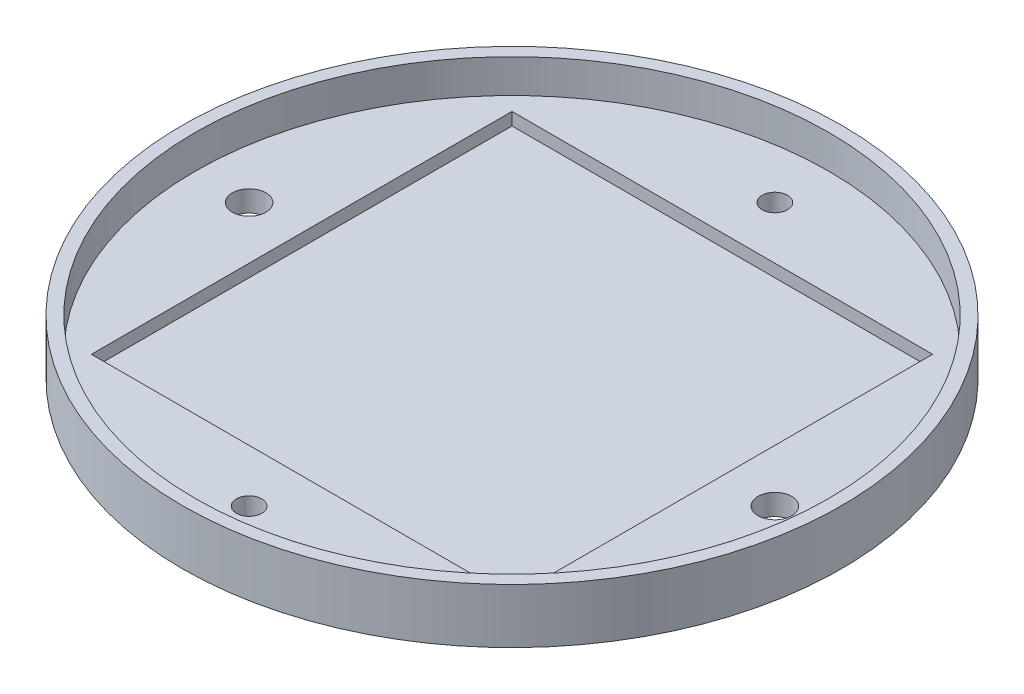
ISO-10303-21;
HEADER;
FILE_DESCRIPTION(('STEP AP214'),'2;1');
FILE_NAME('part.step','',(''),(''),'','','');
FILE_SCHEMA(('AUTOMOTIVE_DESIGN { 1 0 10303 214 1 1 1 1 }'));
ENDSEC;
DATA;
#1=APPLICATION_CONTEXT('core data for automotive mechanical design processes');
#2=APPLICATION_PROTOCOL_DEFINITION('international standard','automotive_design',2000,#1);
#3=PRODUCT_CONTEXT('',#1,'mechanical');
#4=PRODUCT('Part','Part','',(#3));
#5=PRODUCT_RELATED_PRODUCT_CATEGORY('part','',(#4));
#6=PRODUCT_DEFINITION_FORMATION('','',#4);
#7=PRODUCT_DEFINITION_CONTEXT('part definition',#1,'design');
#8=PRODUCT_DEFINITION('design','',#6,#7);
#9=PRODUCT_DEFINITION_SHAPE('','',#8);
#10=(LENGTH_UNIT() NAMED_UNIT(*) SI_UNIT(.MILLI.,.METRE.));
#11=(NAMED_UNIT(*) PLANE_ANGLE_UNIT() SI_UNIT($,.RADIAN.));
#12=(NAMED_UNIT(*) SI_UNIT($,.STERADIAN.) SOLID_ANGLE_UNIT());
#13=UNCERTAINTY_MEASURE_WITH_UNIT(LENGTH_MEASURE(1.E-05),#10,'distance_accuracy_value','');
#14=(GEOMETRIC_REPRESENTATION_CONTEXT(3) GLOBAL_UNCERTAINTY_ASSIGNED_CONTEXT((#13)) GLOBAL_UNIT_ASSIGNED_CONTEXT((#10,
#11,#12)) REPRESENTATION_CONTEXT('',''));
#15=CARTESIAN_POINT('',(0.,0.,0.));
#16=DIRECTION('',(0.,0.,1.));
#17=DIRECTION('',(1.,0.,0.));
#18=AXIS2_PLACEMENT_3D('',#15,#16,#17);
#19=CARTESIAN_POINT('',(0.,5.,0.));
#20=DIRECTION('',(0.,1.,0.));
#21=DIRECTION('',(0.,0.,1.));
#22=AXIS2_PLACEMENT_3D('',#19,#20,#21);
#23=PLANE('',#22);
#24=DIRECTION('',(0.,0.,-1.));
#25=VECTOR('',#24,1.);
#26=CARTESIAN_POINT('',(50.,5.,50.));
#27=LINE('',#26,#25);
#28=CARTESIAN_POINT('',(50.,5.,50.));
#29=VERTEX_POINT('',#28);
#30=CARTESIAN_POINT('',(50.,5.,-50.));
#31=VERTEX_POINT('',#30);
#32=EDGE_CURVE('E55',#29,#31,#27,.T.);
#33=ORIENTED_EDGE('',*,*,#32,.F.);
#34=DIRECTION('',(1.,0.,0.));
#35=VECTOR('',#34,1.);
#36=CARTESIAN_POINT('',(-50.,5.,50.));
#37=LINE('',#36,#35);
#38=CARTESIAN_POINT('',(-50.,5.,50.));
#39=VERTEX_POINT('',#38);
#40=EDGE_CURVE('E110',#39,#29,#37,.T.);
#41=ORIENTED_EDGE('',*,*,#40,.F.);
#42=DIRECTION('',(0.,0.,1.));
#43=VECTOR('',#42,1.);
#44=CARTESIAN_POINT('',(-50.,5.,50.));
#45=LINE('',#44,#43);
#46=CARTESIAN_POINT('',(-50.,5.,-50.));
#47=VERTEX_POINT('',#46);
#48=EDGE_CURVE('E119',#47,#39,#45,.T.);
#49=ORIENTED_EDGE('',*,*,#48,.F.);
#50=DIRECTION('',(-1.,0.,0.));
#51=VECTOR('',#50,1.);
#52=CARTESIAN_POINT('',(-50.,5.,-50.));
#53=LINE('',#52,#51);
#54=EDGE_CURVE('E90',#31,#47,#53,.T.);
#55=ORIENTED_EDGE('',*,*,#54,.F.);
#56=EDGE_LOOP('',(#33,#41,#49,#55));
#57=FACE_BOUND('',#56,.T.);
#58=CARTESIAN_POINT('',(0.,5.,62.5));
#59=DIRECTION('',(0.,1.,0.));
#60=DIRECTION('',(0.,0.,1.));
#61=AXIS2_PLACEMENT_3D('',#58,#59,#60);
#62=CIRCLE('',#61,3.);
#63=CARTESIAN_POINT('',(0.,5.,65.5));
#64=VERTEX_POINT('',#63);
#65=EDGE_CURVE('E139',#64,#64,#62,.T.);
#66=ORIENTED_EDGE('',*,*,#65,.F.);
#67=EDGE_LOOP('',(#66));
#68=FACE_BOUND('',#67,.T.);
#69=CARTESIAN_POINT('',(62.5,5.,0.));
#70=DIRECTION('',(0.,1.,0.));
#71=DIRECTION('',(0.,0.,1.));
#72=AXIS2_PLACEMENT_3D('',#69,#70,#71);
#73=CIRCLE('',#72,4.00000000000001);
#74=CARTESIAN_POINT('',(62.5,5.,4.00000000000001));
#75=VERTEX_POINT('',#74);
#76=EDGE_CURVE('E155',#75,#75,#73,.T.);
#77=ORIENTED_EDGE('',*,*,#76,.F.);
#78=EDGE_LOOP('',(#77));
#79=FACE_BOUND('',#78,.T.);
#80=CARTESIAN_POINT('',(-62.5,5.,0.));
#81=DIRECTION('',(0.,1.,0.));
#82=DIRECTION('',(0.,0.,1.));
#83=AXIS2_PLACEMENT_3D('',#80,#81,#82);
#84=CIRCLE('',#83,4.00000000000001);
#85=CARTESIAN_POINT('',(-62.5,5.,4.00000000000001));
#86=VERTEX_POINT('',#85);
#87=EDGE_CURVE('E163',#86,#86,#84,.T.);
#88=ORIENTED_EDGE('',*,*,#87,.F.);
#89=EDGE_LOOP('',(#88));
#90=FACE_BOUND('',#89,.T.);
#91=CARTESIAN_POINT('',(0.,5.,-62.5));
#92=DIRECTION('',(0.,1.,0.));
#93=DIRECTION('',(0.,0.,1.));
#94=AXIS2_PLACEMENT_3D('',#91,#92,#93);
#95=CIRCLE('',#94,3.);
#96=CARTESIAN_POINT('',(0.,5.,-59.5));
#97=VERTEX_POINT('',#96);
#98=EDGE_CURVE('E147',#97,#97,#95,.T.);
#99=ORIENTED_EDGE('',*,*,#98,.F.);
#100=EDGE_LOOP('',(#99));
#101=FACE_BOUND('',#100,.T.);
#102=CARTESIAN_POINT('',(0.,5.,0.));
#103=DIRECTION('',(0.,1.,0.));
#104=DIRECTION('',(0.,0.,1.));
#105=AXIS2_PLACEMENT_3D('',#102,#103,#104);
#106=CIRCLE('',#105,75.35);
#107=CARTESIAN_POINT('',(0.,5.,75.35));
#108=VERTEX_POINT('',#107);
#109=EDGE_CURVE('E11',#108,#108,#106,.F.);
#110=ORIENTED_EDGE('',*,*,#109,.F.);
#111=EDGE_LOOP('',(#110));
#112=FACE_BOUND('',#111,.T.);
#113=ADVANCED_FACE('F39',(#57,#68,#79,#90,#101,#112),#23,.T.);
#114=CARTESIAN_POINT('',(0.,0.,0.));
#115=DIRECTION('',(0.,1.,0.));
#116=DIRECTION('',(0.,0.,1.));
#117=AXIS2_PLACEMENT_3D('',#114,#115,#116);
#118=PLANE('',#117);
#119=CARTESIAN_POINT('',(0.,0.,0.));
#120=DIRECTION('',(0.,1.,0.));
#121=DIRECTION('',(0.,0.,1.));
#122=AXIS2_PLACEMENT_3D('',#119,#120,#121);
#123=CIRCLE('',#122,78.35);
#124=CARTESIAN_POINT('',(0.,0.,78.35));
#125=VERTEX_POINT('',#124);
#126=EDGE_CURVE('E48',#125,#125,#123,.T.);
#127=ORIENTED_EDGE('',*,*,#126,.F.);
#128=EDGE_LOOP('',(#127));
#129=FACE_BOUND('',#128,.T.);
#130=CARTESIAN_POINT('',(-62.5,0.,0.));
#131=DIRECTION('',(0.,1.,0.));
#132=DIRECTION('',(0.,0.,1.));
#133=AXIS2_PLACEMENT_3D('',#130,#131,#132);
#134=CIRCLE('',#133,4.00000000000001);
#135=CARTESIAN_POINT('',(-62.5,0.,4.00000000000001));
#136=VERTEX_POINT('',#135);
#137=EDGE_CURVE('E159',#136,#136,#134,.T.);
#138=ORIENTED_EDGE('',*,*,#137,.T.);
#139=EDGE_LOOP('',(#138));
#140=FACE_BOUND('',#139,.T.);
#141=CARTESIAN_POINT('',(62.5,0.,0.));
#142=DIRECTION('',(0.,1.,0.));
#143=DIRECTION('',(0.,0.,1.));
#144=AXIS2_PLACEMENT_3D('',#141,#142,#143);
#145=CIRCLE('',#144,4.00000000000001);
#146=CARTESIAN_POINT('',(62.5,0.,4.00000000000001));
#147=VERTEX_POINT('',#146);
#148=EDGE_CURVE('E151',#147,#147,#145,.T.);
#149=ORIENTED_EDGE('',*,*,#148,.T.);
#150=EDGE_LOOP('',(#149));
#151=FACE_BOUND('',#150,.T.);
#152=CARTESIAN_POINT('',(0.,0.,-62.5));
#153=DIRECTION('',(0.,1.,0.));
#154=DIRECTION('',(0.,0.,1.));
#155=AXIS2_PLACEMENT_3D('',#152,#153,#154);
#156=CIRCLE('',#155,3.);
#157=CARTESIAN_POINT('',(0.,0.,-59.5));
#158=VERTEX_POINT('',#157);
#159=EDGE_CURVE('E143',#158,#158,#156,.T.);
#160=ORIENTED_EDGE('',*,*,#159,.T.);
#161=EDGE_LOOP('',(#160));
#162=FACE_BOUND('',#161,.T.);
#163=CARTESIAN_POINT('',(0.,0.,62.5));
#164=DIRECTION('',(0.,1.,0.));
#165=DIRECTION('',(0.,0.,1.));
#166=AXIS2_PLACEMENT_3D('',#163,#164,#165);
#167=CIRCLE('',#166,3.);
#168=CARTESIAN_POINT('',(0.,0.,65.5));
#169=VERTEX_POINT('',#168);
#170=EDGE_CURVE('E138',#169,#169,#167,.T.);
#171=ORIENTED_EDGE('',*,*,#170,.T.);
#172=EDGE_LOOP('',(#171));
#173=FACE_BOUND('',#172,.T.);
#174=ADVANCED_FACE('F175',(#129,#140,#151,#162,#173),#118,.F.);
#175=CARTESIAN_POINT('',(0.,5.,0.));
#176=DIRECTION('',(0.,-1.,0.));
#177=DIRECTION('',(0.,0.,-1.));
#178=AXIS2_PLACEMENT_3D('',#175,#176,#177);
#179=CYLINDRICAL_SURFACE('',#178,78.35);
#180=ORIENTED_EDGE('',*,*,#126,.T.);
#181=EDGE_LOOP('',(#180));
#182=FACE_BOUND('',#181,.T.);
#183=CARTESIAN_POINT('',(0.,13.,0.));
#184=DIRECTION('',(0.,1.,0.));
#185=DIRECTION('',(0.,0.,1.));
#186=AXIS2_PLACEMENT_3D('',#183,#184,#185);
#187=CIRCLE('',#186,78.35);
#188=CARTESIAN_POINT('',(0.,13.,78.35));
#189=VERTEX_POINT('',#188);
#190=EDGE_CURVE('E134',#189,#189,#187,.T.);
#191=ORIENTED_EDGE('',*,*,#190,.F.);
#192=EDGE_LOOP('',(#191));
#193=FACE_BOUND('',#192,.T.);
#194=ADVANCED_FACE('F41',(#182,#193),#179,.T.);
#195=CARTESIAN_POINT('',(-62.5,5.,0.));
#196=DIRECTION('',(0.,-1.,0.));
#197=DIRECTION('',(0.,0.,-1.));
#198=AXIS2_PLACEMENT_3D('',#195,#196,#197);
#199=CYLINDRICAL_SURFACE('',#198,4.00000000000001);
#200=ORIENTED_EDGE('',*,*,#87,.T.);
#201=EDGE_LOOP('',(#200));
#202=FACE_BOUND('',#201,.T.);
#203=ORIENTED_EDGE('',*,*,#137,.F.);
#204=EDGE_LOOP('',(#203));
#205=FACE_BOUND('',#204,.T.);
#206=ADVANCED_FACE('F209',(#202,#205),#199,.F.);
#207=CARTESIAN_POINT('',(62.5,5.,0.));
#208=DIRECTION('',(0.,-1.,0.));
#209=DIRECTION('',(0.,0.,-1.));
#210=AXIS2_PLACEMENT_3D('',#207,#208,#209);
#211=CYLINDRICAL_SURFACE('',#210,4.00000000000001);
#212=ORIENTED_EDGE('',*,*,#76,.T.);
#213=EDGE_LOOP('',(#212));
#214=FACE_BOUND('',#213,.T.);
#215=ORIENTED_EDGE('',*,*,#148,.F.);
#216=EDGE_LOOP('',(#215));
#217=FACE_BOUND('',#216,.T.);
#218=ADVANCED_FACE('F199',(#214,#217),#211,.F.);
#219=CARTESIAN_POINT('',(0.,5.,-62.5));
#220=DIRECTION('',(0.,-1.,0.));
#221=DIRECTION('',(0.,0.,-1.));
#222=AXIS2_PLACEMENT_3D('',#219,#220,#221);
#223=CYLINDRICAL_SURFACE('',#222,3.);
#224=ORIENTED_EDGE('',*,*,#98,.T.);
#225=EDGE_LOOP('',(#224));
#226=FACE_BOUND('',#225,.T.);
#227=ORIENTED_EDGE('',*,*,#159,.F.);
#228=EDGE_LOOP('',(#227));
#229=FACE_BOUND('',#228,.T.);
#230=ADVANCED_FACE('F189',(#226,#229),#223,.F.);
#231=CARTESIAN_POINT('',(0.,5.,62.5));
#232=DIRECTION('',(0.,-1.,0.));
#233=DIRECTION('',(0.,0.,-1.));
#234=AXIS2_PLACEMENT_3D('',#231,#232,#233);
#235=CYLINDRICAL_SURFACE('',#234,3.);
#236=ORIENTED_EDGE('',*,*,#65,.T.);
#237=EDGE_LOOP('',(#236));
#238=FACE_BOUND('',#237,.T.);
#239=ORIENTED_EDGE('',*,*,#170,.F.);
#240=EDGE_LOOP('',(#239));
#241=FACE_BOUND('',#240,.T.);
#242=ADVANCED_FACE('F186',(#238,#241),#235,.F.);
#243=CARTESIAN_POINT('',(0.,13.,0.));
#244=DIRECTION('',(0.,1.,0.));
#245=DIRECTION('',(0.,0.,1.));
#246=AXIS2_PLACEMENT_3D('',#243,#244,#245);
#247=PLANE('',#246);
#248=ORIENTED_EDGE('',*,*,#190,.T.);
#249=EDGE_LOOP('',(#248));
#250=FACE_BOUND('',#249,.T.);
#251=CARTESIAN_POINT('',(0.,13.,0.));
#252=DIRECTION('',(0.,1.,0.));
#253=DIRECTION('',(0.,0.,1.));
#254=AXIS2_PLACEMENT_3D('',#251,#252,#253);
#255=CIRCLE('',#254,75.35);
#256=CARTESIAN_POINT('',(0.,13.,75.35));
#257=VERTEX_POINT('',#256);
#258=EDGE_CURVE('E126',#257,#257,#255,.T.);
#259=ORIENTED_EDGE('',*,*,#258,.F.);
#260=EDGE_LOOP('',(#259));
#261=FACE_BOUND('',#260,.T.);
#262=ADVANCED_FACE('F188',(#250,#261),#247,.T.);
#263=CARTESIAN_POINT('',(0.,13.,0.));
#264=DIRECTION('',(0.,-1.,0.));
#265=DIRECTION('',(0.,0.,-1.));
#266=AXIS2_PLACEMENT_3D('',#263,#264,#265);
#267=CYLINDRICAL_SURFACE('',#266,75.35);
#268=ORIENTED_EDGE('',*,*,#258,.T.);
#269=EDGE_LOOP('',(#268));
#270=FACE_BOUND('',#269,.T.);
#271=ORIENTED_EDGE('',*,*,#109,.T.);
#272=EDGE_LOOP('',(#271));
#273=FACE_BOUND('',#272,.T.);
#274=ADVANCED_FACE('F196',(#270,#273),#267,.F.);
#275=CARTESIAN_POINT('',(50.,2.,50.));
#276=DIRECTION('',(1.,0.,0.));
#277=DIRECTION('',(0.,0.,-1.));
#278=AXIS2_PLACEMENT_3D('',#275,#276,#277);
#279=PLANE('',#278);
#280=ORIENTED_EDGE('',*,*,#32,.T.);
#281=DIRECTION('',(0.,1.,0.));
#282=VECTOR('',#281,1.);
#283=CARTESIAN_POINT('',(50.,2.,-50.));
#284=LINE('',#283,#282);
#285=CARTESIAN_POINT('',(50.,2.,-50.));
#286=VERTEX_POINT('',#285);
#287=EDGE_CURVE('E78',#286,#31,#284,.T.);
#288=ORIENTED_EDGE('',*,*,#287,.F.);
#289=DIRECTION('',(0.,0.,-1.));
#290=VECTOR('',#289,1.);
#291=CARTESIAN_POINT('',(50.,2.,50.));
#292=LINE('',#291,#290);
#293=CARTESIAN_POINT('',(50.,2.,50.));
#294=VERTEX_POINT('',#293);
#295=EDGE_CURVE('E106',#294,#286,#292,.T.);
#296=ORIENTED_EDGE('',*,*,#295,.F.);
#297=DIRECTION('',(0.,1.,0.));
#298=VECTOR('',#297,1.);
#299=CARTESIAN_POINT('',(50.,2.,50.));
#300=LINE('',#299,#298);
#301=EDGE_CURVE('E63',#294,#29,#300,.T.);
#302=ORIENTED_EDGE('',*,*,#301,.T.);
#303=EDGE_LOOP('',(#280,#288,#296,#302));
#304=FACE_BOUND('',#303,.T.);
#305=ADVANCED_FACE('F228',(#304),#279,.F.);
#306=CARTESIAN_POINT('',(-50.,2.,50.));
#307=DIRECTION('',(0.,0.,1.));
#308=DIRECTION('',(1.,0.,0.));
#309=AXIS2_PLACEMENT_3D('',#306,#307,#308);
#310=PLANE('',#309);
#311=ORIENTED_EDGE('',*,*,#40,.T.);
#312=ORIENTED_EDGE('',*,*,#301,.F.);
#313=DIRECTION('',(1.,0.,0.));
#314=VECTOR('',#313,1.);
#315=CARTESIAN_POINT('',(-50.,2.,50.));
#316=LINE('',#315,#314);
#317=CARTESIAN_POINT('',(-50.,2.,50.));
#318=VERTEX_POINT('',#317);
#319=EDGE_CURVE('E103',#318,#294,#316,.T.);
#320=ORIENTED_EDGE('',*,*,#319,.F.);
#321=DIRECTION('',(0.,1.,0.));
#322=VECTOR('',#321,1.);
#323=CARTESIAN_POINT('',(-50.,2.,50.));
#324=LINE('',#323,#322);
#325=EDGE_CURVE('E95',#318,#39,#324,.T.);
#326=ORIENTED_EDGE('',*,*,#325,.T.);
#327=EDGE_LOOP('',(#311,#312,#320,#326));
#328=FACE_BOUND('',#327,.T.);
#329=ADVANCED_FACE('F234',(#328),#310,.F.);
#330=CARTESIAN_POINT('',(-50.,2.,50.));
#331=DIRECTION('',(-1.,0.,0.));
#332=DIRECTION('',(0.,0.,1.));
#333=AXIS2_PLACEMENT_3D('',#330,#331,#332);
#334=PLANE('',#333);
#335=ORIENTED_EDGE('',*,*,#48,.T.);
#336=ORIENTED_EDGE('',*,*,#325,.F.);
#337=DIRECTION('',(0.,0.,1.));
#338=VECTOR('',#337,1.);
#339=CARTESIAN_POINT('',(-50.,2.,50.));
#340=LINE('',#339,#338);
#341=CARTESIAN_POINT('',(-50.,2.,-50.));
#342=VERTEX_POINT('',#341);
#343=EDGE_CURVE('E98',#342,#318,#340,.T.);
#344=ORIENTED_EDGE('',*,*,#343,.F.);
#345=DIRECTION('',(0.,1.,0.));
#346=VECTOR('',#345,1.);
#347=CARTESIAN_POINT('',(-50.,2.,-50.));
#348=LINE('',#347,#346);
#349=EDGE_CURVE('E83',#342,#47,#348,.T.);
#350=ORIENTED_EDGE('',*,*,#349,.T.);
#351=EDGE_LOOP('',(#335,#336,#344,#350));
#352=FACE_BOUND('',#351,.T.);
#353=ADVANCED_FACE('F99',(#352),#334,.F.);
#354=CARTESIAN_POINT('',(-50.,2.,-50.));
#355=DIRECTION('',(0.,0.,-1.));
#356=DIRECTION('',(-1.,0.,0.));
#357=AXIS2_PLACEMENT_3D('',#354,#355,#356);
#358=PLANE('',#357);
#359=ORIENTED_EDGE('',*,*,#54,.T.);
#360=ORIENTED_EDGE('',*,*,#349,.F.);
#361=DIRECTION('',(-1.,0.,0.));
#362=VECTOR('',#361,1.);
#363=CARTESIAN_POINT('',(-50.,2.,-50.));
#364=LINE('',#363,#362);
#365=EDGE_CURVE('E87',#286,#342,#364,.T.);
#366=ORIENTED_EDGE('',*,*,#365,.F.);
#367=ORIENTED_EDGE('',*,*,#287,.T.);
#368=EDGE_LOOP('',(#359,#360,#366,#367));
#369=FACE_BOUND('',#368,.T.);
#370=ADVANCED_FACE('F85',(#369),#358,.F.);
#371=CARTESIAN_POINT('',(0.,2.,0.));
#372=DIRECTION('',(0.,-1.,0.));
#373=DIRECTION('',(0.,0.,-1.));
#374=AXIS2_PLACEMENT_3D('',#371,#372,#373);
#375=PLANE('',#374);
#376=ORIENTED_EDGE('',*,*,#295,.T.);
#377=ORIENTED_EDGE('',*,*,#365,.T.);
#378=ORIENTED_EDGE('',*,*,#343,.T.);
#379=ORIENTED_EDGE('',*,*,#319,.T.);
#380=EDGE_LOOP('',(#376,#377,#378,#379));
#381=FACE_BOUND('',#380,.T.);
#382=ADVANCED_FACE('F105',(#381),#375,.F.);
#383=CLOSED_SHELL('',(#113,#174,#194,#206,#218,#230,#242,#262,#274,#305,#329,#353,#370,#382));
#384=MANIFOLD_SOLID_BREP('B2',#383);
#385=ADVANCED_BREP_SHAPE_REPRESENTATION('',(#18,#384),#14);
#386=SHAPE_DEFINITION_REPRESENTATION(#9,#385);
ENDSEC;
END-ISO-10303-21;
